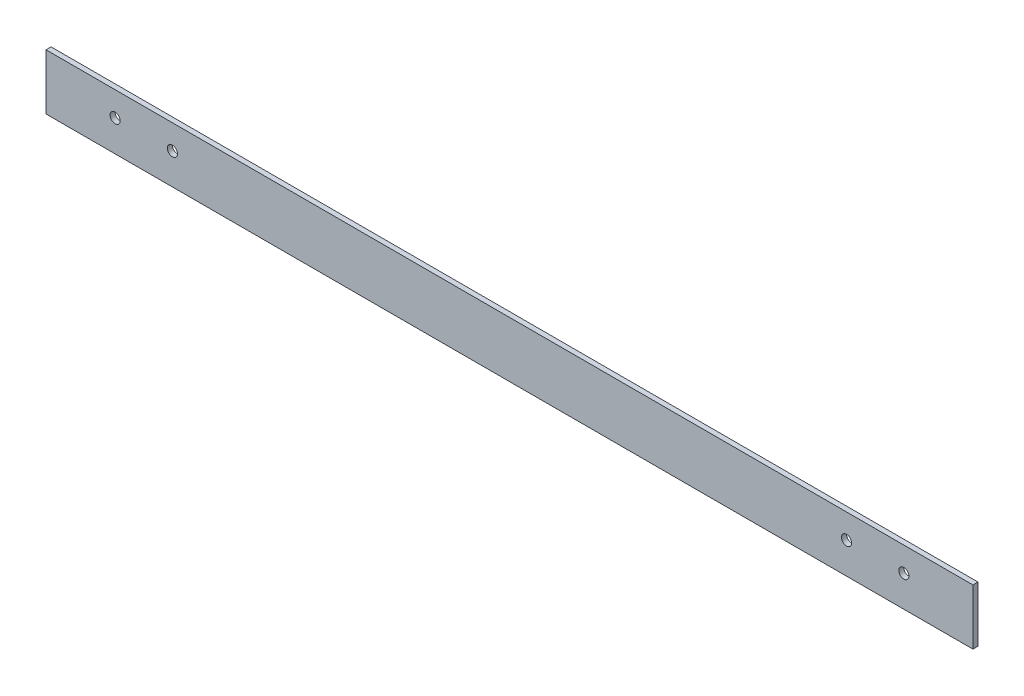
ISO-10303-21;
HEADER;
FILE_DESCRIPTION(('STEP AP214'),'2;1');
FILE_NAME('part.step','',(''),(''),'','','');
FILE_SCHEMA(('AUTOMOTIVE_DESIGN { 1 0 10303 214 1 1 1 1 }'));
ENDSEC;
DATA;
#1=APPLICATION_CONTEXT('core data for automotive mechanical design processes');
#2=APPLICATION_PROTOCOL_DEFINITION('international standard','automotive_design',2000,#1);
#3=PRODUCT_CONTEXT('',#1,'mechanical');
#4=PRODUCT('Part','Part','',(#3));
#5=PRODUCT_RELATED_PRODUCT_CATEGORY('part','',(#4));
#6=PRODUCT_DEFINITION_FORMATION('','',#4);
#7=PRODUCT_DEFINITION_CONTEXT('part definition',#1,'design');
#8=PRODUCT_DEFINITION('design','',#6,#7);
#9=PRODUCT_DEFINITION_SHAPE('','',#8);
#10=(LENGTH_UNIT() NAMED_UNIT(*) SI_UNIT(.MILLI.,.METRE.));
#11=(NAMED_UNIT(*) PLANE_ANGLE_UNIT() SI_UNIT($,.RADIAN.));
#12=(NAMED_UNIT(*) SI_UNIT($,.STERADIAN.) SOLID_ANGLE_UNIT());
#13=UNCERTAINTY_MEASURE_WITH_UNIT(LENGTH_MEASURE(1.E-05),#10,'distance_accuracy_value','');
#14=(GEOMETRIC_REPRESENTATION_CONTEXT(3) GLOBAL_UNCERTAINTY_ASSIGNED_CONTEXT((#13)) GLOBAL_UNIT_ASSIGNED_CONTEXT((#10,
#11,#12)) REPRESENTATION_CONTEXT('',''));
#15=CARTESIAN_POINT('',(0.,0.,0.));
#16=DIRECTION('',(0.,0.,1.));
#17=DIRECTION('',(1.,0.,0.));
#18=AXIS2_PLACEMENT_3D('',#15,#16,#17);
#19=CARTESIAN_POINT('',(-275.,16.5,3.));
#20=DIRECTION('',(1.,0.,0.));
#21=DIRECTION('',(0.,0.,-1.));
#22=AXIS2_PLACEMENT_3D('',#19,#20,#21);
#23=PLANE('',#22);
#24=DIRECTION('',(0.,-1.,0.));
#25=VECTOR('',#24,1.);
#26=CARTESIAN_POINT('',(-275.,16.5,0.));
#27=LINE('',#26,#25);
#28=CARTESIAN_POINT('',(-275.,16.5,0.));
#29=VERTEX_POINT('',#28);
#30=CARTESIAN_POINT('',(-275.,-16.5,0.));
#31=VERTEX_POINT('',#30);
#32=EDGE_CURVE('E98',#29,#31,#27,.T.);
#33=ORIENTED_EDGE('',*,*,#32,.T.);
#34=DIRECTION('',(0.,0.,-1.));
#35=VECTOR('',#34,1.);
#36=CARTESIAN_POINT('',(-275.,-16.5,3.));
#37=LINE('',#36,#35);
#38=CARTESIAN_POINT('',(-275.,-16.5,3.));
#39=VERTEX_POINT('',#38);
#40=EDGE_CURVE('E11',#39,#31,#37,.T.);
#41=ORIENTED_EDGE('',*,*,#40,.F.);
#42=DIRECTION('',(0.,-1.,0.));
#43=VECTOR('',#42,1.);
#44=CARTESIAN_POINT('',(-275.,16.5,3.));
#45=LINE('',#44,#43);
#46=CARTESIAN_POINT('',(-275.,16.5,3.));
#47=VERTEX_POINT('',#46);
#48=EDGE_CURVE('E86',#47,#39,#45,.T.);
#49=ORIENTED_EDGE('',*,*,#48,.F.);
#50=DIRECTION('',(0.,0.,-1.));
#51=VECTOR('',#50,1.);
#52=CARTESIAN_POINT('',(-275.,16.5,3.));
#53=LINE('',#52,#51);
#54=EDGE_CURVE('E94',#47,#29,#53,.T.);
#55=ORIENTED_EDGE('',*,*,#54,.T.);
#56=EDGE_LOOP('',(#33,#41,#49,#55));
#57=FACE_BOUND('',#56,.T.);
#58=ADVANCED_FACE('F35',(#57),#23,.F.);
#59=CARTESIAN_POINT('',(-275.,-16.5,3.));
#60=DIRECTION('',(0.,1.,0.));
#61=DIRECTION('',(0.,0.,1.));
#62=AXIS2_PLACEMENT_3D('',#59,#60,#61);
#63=PLANE('',#62);
#64=DIRECTION('',(1.,0.,0.));
#65=VECTOR('',#64,1.);
#66=CARTESIAN_POINT('',(-275.,-16.5,0.));
#67=LINE('',#66,#65);
#68=CARTESIAN_POINT('',(275.,-16.5,0.));
#69=VERTEX_POINT('',#68);
#70=EDGE_CURVE('E90',#31,#69,#67,.T.);
#71=ORIENTED_EDGE('',*,*,#70,.T.);
#72=DIRECTION('',(0.,0.,-1.));
#73=VECTOR('',#72,1.);
#74=CARTESIAN_POINT('',(275.,-16.5,3.));
#75=LINE('',#74,#73);
#76=CARTESIAN_POINT('',(275.,-16.5,3.));
#77=VERTEX_POINT('',#76);
#78=EDGE_CURVE('E43',#77,#69,#75,.T.);
#79=ORIENTED_EDGE('',*,*,#78,.F.);
#80=DIRECTION('',(1.,0.,0.));
#81=VECTOR('',#80,1.);
#82=CARTESIAN_POINT('',(-275.,-16.5,3.));
#83=LINE('',#82,#81);
#84=EDGE_CURVE('E81',#39,#77,#83,.T.);
#85=ORIENTED_EDGE('',*,*,#84,.F.);
#86=ORIENTED_EDGE('',*,*,#40,.T.);
#87=EDGE_LOOP('',(#71,#79,#85,#86));
#88=FACE_BOUND('',#87,.T.);
#89=ADVANCED_FACE('F89',(#88),#63,.F.);
#90=CARTESIAN_POINT('',(275.,16.5,3.));
#91=DIRECTION('',(-1.,0.,0.));
#92=DIRECTION('',(0.,0.,1.));
#93=AXIS2_PLACEMENT_3D('',#90,#91,#92);
#94=PLANE('',#93);
#95=DIRECTION('',(0.,1.,0.));
#96=VECTOR('',#95,1.);
#97=CARTESIAN_POINT('',(275.,16.5,0.));
#98=LINE('',#97,#96);
#99=CARTESIAN_POINT('',(275.,16.5,0.));
#100=VERTEX_POINT('',#99);
#101=EDGE_CURVE('E68',#69,#100,#98,.T.);
#102=ORIENTED_EDGE('',*,*,#101,.T.);
#103=DIRECTION('',(0.,0.,-1.));
#104=VECTOR('',#103,1.);
#105=CARTESIAN_POINT('',(275.,16.5,3.));
#106=LINE('',#105,#104);
#107=CARTESIAN_POINT('',(275.,16.5,3.));
#108=VERTEX_POINT('',#107);
#109=EDGE_CURVE('E91',#108,#100,#106,.T.);
#110=ORIENTED_EDGE('',*,*,#109,.F.);
#111=DIRECTION('',(0.,1.,0.));
#112=VECTOR('',#111,1.);
#113=CARTESIAN_POINT('',(275.,16.5,3.));
#114=LINE('',#113,#112);
#115=EDGE_CURVE('E84',#77,#108,#114,.T.);
#116=ORIENTED_EDGE('',*,*,#115,.F.);
#117=ORIENTED_EDGE('',*,*,#78,.T.);
#118=EDGE_LOOP('',(#102,#110,#116,#117));
#119=FACE_BOUND('',#118,.T.);
#120=ADVANCED_FACE('F92',(#119),#94,.F.);
#121=CARTESIAN_POINT('',(-275.,16.5,3.));
#122=DIRECTION('',(0.,-1.,0.));
#123=DIRECTION('',(0.,0.,-1.));
#124=AXIS2_PLACEMENT_3D('',#121,#122,#123);
#125=PLANE('',#124);
#126=DIRECTION('',(-1.,0.,0.));
#127=VECTOR('',#126,1.);
#128=CARTESIAN_POINT('',(-275.,16.5,0.));
#129=LINE('',#128,#127);
#130=EDGE_CURVE('E74',#100,#29,#129,.T.);
#131=ORIENTED_EDGE('',*,*,#130,.T.);
#132=ORIENTED_EDGE('',*,*,#54,.F.);
#133=DIRECTION('',(-1.,0.,0.));
#134=VECTOR('',#133,1.);
#135=CARTESIAN_POINT('',(-275.,16.5,3.));
#136=LINE('',#135,#134);
#137=EDGE_CURVE('E51',#108,#47,#136,.T.);
#138=ORIENTED_EDGE('',*,*,#137,.F.);
#139=ORIENTED_EDGE('',*,*,#109,.T.);
#140=EDGE_LOOP('',(#131,#132,#138,#139));
#141=FACE_BOUND('',#140,.T.);
#142=ADVANCED_FACE('F106',(#141),#125,.F.);
#143=CARTESIAN_POINT('',(0.,0.,3.));
#144=DIRECTION('',(0.,0.,1.));
#145=DIRECTION('',(1.,0.,0.));
#146=AXIS2_PLACEMENT_3D('',#143,#144,#145);
#147=PLANE('',#146);
#148=CARTESIAN_POINT('',(-234.,1.99999999999999,3.));
#149=DIRECTION('',(0.,0.,1.));
#150=DIRECTION('',(1.,0.,0.));
#151=AXIS2_PLACEMENT_3D('',#148,#149,#150);
#152=CIRCLE('',#151,2.99999999999999);
#153=CARTESIAN_POINT('',(-231.,1.99999999999999,3.));
#154=VERTEX_POINT('',#153);
#155=EDGE_CURVE('E101',#154,#154,#152,.T.);
#156=ORIENTED_EDGE('',*,*,#155,.F.);
#157=EDGE_LOOP('',(#156));
#158=FACE_BOUND('',#157,.T.);
#159=CARTESIAN_POINT('',(-200.,2.,3.));
#160=DIRECTION('',(0.,0.,1.));
#161=DIRECTION('',(1.,0.,0.));
#162=AXIS2_PLACEMENT_3D('',#159,#160,#161);
#163=CIRCLE('',#162,2.99999999999999);
#164=CARTESIAN_POINT('',(-197.,2.,3.));
#165=VERTEX_POINT('',#164);
#166=EDGE_CURVE('E127',#165,#165,#163,.T.);
#167=ORIENTED_EDGE('',*,*,#166,.F.);
#168=EDGE_LOOP('',(#167));
#169=FACE_BOUND('',#168,.T.);
#170=CARTESIAN_POINT('',(200.,2.,3.));
#171=DIRECTION('',(0.,0.,1.));
#172=DIRECTION('',(-1.,0.,0.));
#173=AXIS2_PLACEMENT_3D('',#170,#171,#172);
#174=CIRCLE('',#173,2.99999999999999);
#175=CARTESIAN_POINT('',(197.,2.,3.));
#176=VERTEX_POINT('',#175);
#177=EDGE_CURVE('E121',#176,#176,#174,.T.);
#178=ORIENTED_EDGE('',*,*,#177,.F.);
#179=EDGE_LOOP('',(#178));
#180=FACE_BOUND('',#179,.T.);
#181=CARTESIAN_POINT('',(234.,1.99999999999999,3.));
#182=DIRECTION('',(0.,0.,1.));
#183=DIRECTION('',(-1.,0.,0.));
#184=AXIS2_PLACEMENT_3D('',#181,#182,#183);
#185=CIRCLE('',#184,2.99999999999999);
#186=CARTESIAN_POINT('',(231.,1.99999999999999,3.));
#187=VERTEX_POINT('',#186);
#188=EDGE_CURVE('E115',#187,#187,#185,.T.);
#189=ORIENTED_EDGE('',*,*,#188,.F.);
#190=EDGE_LOOP('',(#189));
#191=FACE_BOUND('',#190,.T.);
#192=ORIENTED_EDGE('',*,*,#48,.T.);
#193=ORIENTED_EDGE('',*,*,#84,.T.);
#194=ORIENTED_EDGE('',*,*,#115,.T.);
#195=ORIENTED_EDGE('',*,*,#137,.T.);
#196=EDGE_LOOP('',(#192,#193,#194,#195));
#197=FACE_BOUND('',#196,.T.);
#198=ADVANCED_FACE('F82',(#158,#169,#180,#191,#197),#147,.T.);
#199=CARTESIAN_POINT('',(0.,0.,0.));
#200=DIRECTION('',(0.,0.,1.));
#201=DIRECTION('',(1.,0.,0.));
#202=AXIS2_PLACEMENT_3D('',#199,#200,#201);
#203=PLANE('',#202);
#204=CARTESIAN_POINT('',(-234.,1.99999999999999,0.));
#205=DIRECTION('',(0.,0.,1.));
#206=DIRECTION('',(1.,0.,0.));
#207=AXIS2_PLACEMENT_3D('',#204,#205,#206);
#208=CIRCLE('',#207,2.99999999999999);
#209=CARTESIAN_POINT('',(-231.,1.99999999999999,0.));
#210=VERTEX_POINT('',#209);
#211=EDGE_CURVE('E130',#210,#210,#208,.T.);
#212=ORIENTED_EDGE('',*,*,#211,.T.);
#213=EDGE_LOOP('',(#212));
#214=FACE_BOUND('',#213,.T.);
#215=CARTESIAN_POINT('',(-200.,2.,0.));
#216=DIRECTION('',(0.,0.,1.));
#217=DIRECTION('',(1.,0.,0.));
#218=AXIS2_PLACEMENT_3D('',#215,#216,#217);
#219=CIRCLE('',#218,2.99999999999999);
#220=CARTESIAN_POINT('',(-197.,2.,0.));
#221=VERTEX_POINT('',#220);
#222=EDGE_CURVE('E124',#221,#221,#219,.T.);
#223=ORIENTED_EDGE('',*,*,#222,.T.);
#224=EDGE_LOOP('',(#223));
#225=FACE_BOUND('',#224,.T.);
#226=CARTESIAN_POINT('',(200.,2.,0.));
#227=DIRECTION('',(0.,0.,1.));
#228=DIRECTION('',(-1.,0.,0.));
#229=AXIS2_PLACEMENT_3D('',#226,#227,#228);
#230=CIRCLE('',#229,2.99999999999999);
#231=CARTESIAN_POINT('',(197.,2.,0.));
#232=VERTEX_POINT('',#231);
#233=EDGE_CURVE('E118',#232,#232,#230,.T.);
#234=ORIENTED_EDGE('',*,*,#233,.T.);
#235=EDGE_LOOP('',(#234));
#236=FACE_BOUND('',#235,.T.);
#237=CARTESIAN_POINT('',(234.,1.99999999999999,0.));
#238=DIRECTION('',(0.,0.,1.));
#239=DIRECTION('',(-1.,0.,0.));
#240=AXIS2_PLACEMENT_3D('',#237,#238,#239);
#241=CIRCLE('',#240,2.99999999999999);
#242=CARTESIAN_POINT('',(231.,1.99999999999999,0.));
#243=VERTEX_POINT('',#242);
#244=EDGE_CURVE('E112',#243,#243,#241,.T.);
#245=ORIENTED_EDGE('',*,*,#244,.T.);
#246=EDGE_LOOP('',(#245));
#247=FACE_BOUND('',#246,.T.);
#248=ORIENTED_EDGE('',*,*,#32,.F.);
#249=ORIENTED_EDGE('',*,*,#130,.F.);
#250=ORIENTED_EDGE('',*,*,#101,.F.);
#251=ORIENTED_EDGE('',*,*,#70,.F.);
#252=EDGE_LOOP('',(#248,#249,#250,#251));
#253=FACE_BOUND('',#252,.T.);
#254=ADVANCED_FACE('F109',(#214,#225,#236,#247,#253),#203,.F.);
#255=CARTESIAN_POINT('',(234.,1.99999999999999,3.));
#256=DIRECTION('',(0.,0.,-1.));
#257=DIRECTION('',(-1.,0.,0.));
#258=AXIS2_PLACEMENT_3D('',#255,#256,#257);
#259=CYLINDRICAL_SURFACE('',#258,2.99999999999999);
#260=ORIENTED_EDGE('',*,*,#188,.T.);
#261=EDGE_LOOP('',(#260));
#262=FACE_BOUND('',#261,.T.);
#263=ORIENTED_EDGE('',*,*,#244,.F.);
#264=EDGE_LOOP('',(#263));
#265=FACE_BOUND('',#264,.T.);
#266=ADVANCED_FACE('F148',(#262,#265),#259,.F.);
#267=CARTESIAN_POINT('',(200.,2.,3.));
#268=DIRECTION('',(0.,0.,-1.));
#269=DIRECTION('',(-1.,0.,0.));
#270=AXIS2_PLACEMENT_3D('',#267,#268,#269);
#271=CYLINDRICAL_SURFACE('',#270,2.99999999999999);
#272=ORIENTED_EDGE('',*,*,#177,.T.);
#273=EDGE_LOOP('',(#272));
#274=FACE_BOUND('',#273,.T.);
#275=ORIENTED_EDGE('',*,*,#233,.F.);
#276=EDGE_LOOP('',(#275));
#277=FACE_BOUND('',#276,.T.);
#278=ADVANCED_FACE('F151',(#274,#277),#271,.F.);
#279=CARTESIAN_POINT('',(-200.,2.,3.));
#280=DIRECTION('',(0.,0.,-1.));
#281=DIRECTION('',(-1.,0.,0.));
#282=AXIS2_PLACEMENT_3D('',#279,#280,#281);
#283=CYLINDRICAL_SURFACE('',#282,2.99999999999999);
#284=ORIENTED_EDGE('',*,*,#166,.T.);
#285=EDGE_LOOP('',(#284));
#286=FACE_BOUND('',#285,.T.);
#287=ORIENTED_EDGE('',*,*,#222,.F.);
#288=EDGE_LOOP('',(#287));
#289=FACE_BOUND('',#288,.T.);
#290=ADVANCED_FACE('F198',(#286,#289),#283,.F.);
#291=CARTESIAN_POINT('',(-234.,1.99999999999999,3.));
#292=DIRECTION('',(0.,0.,-1.));
#293=DIRECTION('',(-1.,0.,0.));
#294=AXIS2_PLACEMENT_3D('',#291,#292,#293);
#295=CYLINDRICAL_SURFACE('',#294,2.99999999999999);
#296=ORIENTED_EDGE('',*,*,#155,.T.);
#297=EDGE_LOOP('',(#296));
#298=FACE_BOUND('',#297,.T.);
#299=ORIENTED_EDGE('',*,*,#211,.F.);
#300=EDGE_LOOP('',(#299));
#301=FACE_BOUND('',#300,.T.);
#302=ADVANCED_FACE('F136',(#298,#301),#295,.F.);
#303=CLOSED_SHELL('',(#58,#89,#120,#142,#198,#254,#266,#278,#290,#302));
#304=MANIFOLD_SOLID_BREP('B2',#303);
#305=ADVANCED_BREP_SHAPE_REPRESENTATION('',(#18,#304),#14);
#306=SHAPE_DEFINITION_REPRESENTATION(#9,#305);
ENDSEC;
END-ISO-10303-21;
